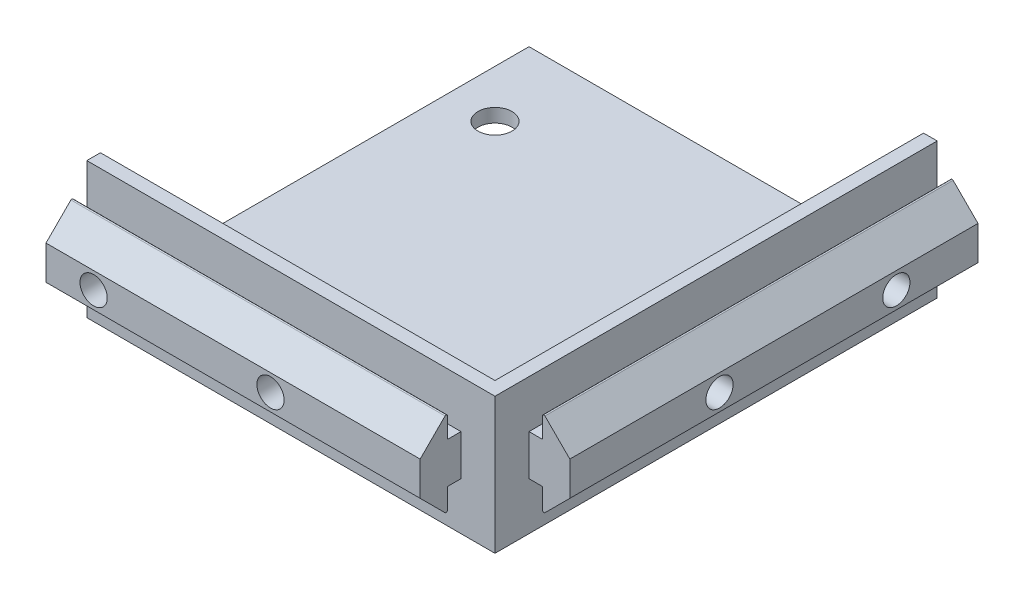
ISO-10303-21;
HEADER;
FILE_DESCRIPTION(('STEP AP214'),'2;1');
FILE_NAME('part.step','',(''),(''),'','','');
FILE_SCHEMA(('AUTOMOTIVE_DESIGN { 1 0 10303 214 1 1 1 1 }'));
ENDSEC;
DATA;
#1=APPLICATION_CONTEXT('core data for automotive mechanical design processes');
#2=APPLICATION_PROTOCOL_DEFINITION('international standard','automotive_design',2000,#1);
#3=PRODUCT_CONTEXT('',#1,'mechanical');
#4=PRODUCT('Part','Part','',(#3));
#5=PRODUCT_RELATED_PRODUCT_CATEGORY('part','',(#4));
#6=PRODUCT_DEFINITION_FORMATION('','',#4);
#7=PRODUCT_DEFINITION_CONTEXT('part definition',#1,'design');
#8=PRODUCT_DEFINITION('design','',#6,#7);
#9=PRODUCT_DEFINITION_SHAPE('','',#8);
#10=(LENGTH_UNIT() NAMED_UNIT(*) SI_UNIT(.MILLI.,.METRE.));
#11=(NAMED_UNIT(*) PLANE_ANGLE_UNIT() SI_UNIT($,.RADIAN.));
#12=(NAMED_UNIT(*) SI_UNIT($,.STERADIAN.) SOLID_ANGLE_UNIT());
#13=UNCERTAINTY_MEASURE_WITH_UNIT(LENGTH_MEASURE(1.E-05),#10,'distance_accuracy_value','');
#14=(GEOMETRIC_REPRESENTATION_CONTEXT(3) GLOBAL_UNCERTAINTY_ASSIGNED_CONTEXT((#13)) GLOBAL_UNIT_ASSIGNED_CONTEXT((#10,
#11,#12)) REPRESENTATION_CONTEXT('',''));
#15=CARTESIAN_POINT('',(0.,0.,0.));
#16=DIRECTION('',(0.,0.,1.));
#17=DIRECTION('',(1.,0.,0.));
#18=AXIS2_PLACEMENT_3D('',#15,#16,#17);
#19=CARTESIAN_POINT('',(30.,-20.,0.));
#20=DIRECTION('',(-1.,0.,0.));
#21=DIRECTION('',(0.,0.,1.));
#22=AXIS2_PLACEMENT_3D('',#19,#20,#21);
#23=PLANE('',#22);
#24=DIRECTION('',(0.,1.,0.));
#25=VECTOR('',#24,1.);
#26=CARTESIAN_POINT('',(30.,-20.,30.));
#27=LINE('',#26,#25);
#28=CARTESIAN_POINT('',(30.,-20.,30.));
#29=VERTEX_POINT('',#28);
#30=CARTESIAN_POINT('',(30.,0.,30.));
#31=VERTEX_POINT('',#30);
#32=EDGE_CURVE('E29',#29,#31,#27,.T.);
#33=ORIENTED_EDGE('',*,*,#32,.F.);
#34=DIRECTION('',(0.,0.,-1.));
#35=VECTOR('',#34,1.);
#36=CARTESIAN_POINT('',(30.,-20.,30.));
#37=LINE('',#36,#35);
#38=CARTESIAN_POINT('',(30.,-20.,-35.));
#39=VERTEX_POINT('',#38);
#40=EDGE_CURVE('E218',#29,#39,#37,.T.);
#41=ORIENTED_EDGE('',*,*,#40,.T.);
#42=DIRECTION('',(0.,-1.,0.));
#43=VECTOR('',#42,1.);
#44=CARTESIAN_POINT('',(30.,0.,-35.));
#45=LINE('',#44,#43);
#46=CARTESIAN_POINT('',(30.,-13.,-35.));
#47=VERTEX_POINT('',#46);
#48=EDGE_CURVE('E216',#47,#39,#45,.T.);
#49=ORIENTED_EDGE('',*,*,#48,.F.);
#50=DIRECTION('',(0.,0.,-1.));
#51=VECTOR('',#50,1.);
#52=CARTESIAN_POINT('',(30.,-13.,25.));
#53=LINE('',#52,#51);
#54=CARTESIAN_POINT('',(30.,-13.,25.));
#55=VERTEX_POINT('',#54);
#56=EDGE_CURVE('E202',#55,#47,#53,.T.);
#57=ORIENTED_EDGE('',*,*,#56,.F.);
#58=DIRECTION('',(0.,-1.,0.));
#59=VECTOR('',#58,1.);
#60=CARTESIAN_POINT('',(30.,0.,25.));
#61=LINE('',#60,#59);
#62=CARTESIAN_POINT('',(30.,-7.,25.));
#63=VERTEX_POINT('',#62);
#64=EDGE_CURVE('E359',#63,#55,#61,.T.);
#65=ORIENTED_EDGE('',*,*,#64,.F.);
#66=DIRECTION('',(0.,0.,-1.));
#67=VECTOR('',#66,1.);
#68=CARTESIAN_POINT('',(30.,-7.,25.));
#69=LINE('',#68,#67);
#70=CARTESIAN_POINT('',(30.,-7.,-35.));
#71=VERTEX_POINT('',#70);
#72=EDGE_CURVE('E212',#63,#71,#69,.T.);
#73=ORIENTED_EDGE('',*,*,#72,.T.);
#74=DIRECTION('',(0.,-1.,0.));
#75=VECTOR('',#74,1.);
#76=CARTESIAN_POINT('',(30.,0.,-35.));
#77=LINE('',#76,#75);
#78=CARTESIAN_POINT('',(30.,0.,-35.));
#79=VERTEX_POINT('',#78);
#80=EDGE_CURVE('E244',#79,#71,#77,.T.);
#81=ORIENTED_EDGE('',*,*,#80,.F.);
#82=DIRECTION('',(0.,0.,1.));
#83=VECTOR('',#82,1.);
#84=CARTESIAN_POINT('',(30.,0.,0.));
#85=LINE('',#84,#83);
#86=EDGE_CURVE('E440',#79,#31,#85,.T.);
#87=ORIENTED_EDGE('',*,*,#86,.T.);
#88=EDGE_LOOP('',(#33,#41,#49,#57,#65,#73,#81,#87));
#89=FACE_BOUND('',#88,.T.);
#90=ADVANCED_FACE('F20',(#89),#23,.F.);
#91=CARTESIAN_POINT('',(0.,-20.,28.));
#92=DIRECTION('',(0.,0.,1.));
#93=DIRECTION('',(1.,0.,0.));
#94=AXIS2_PLACEMENT_3D('',#91,#92,#93);
#95=PLANE('',#94);
#96=CARTESIAN_POINT('',(3.,-10.,28.));
#97=DIRECTION('',(0.,0.,1.));
#98=DIRECTION('',(1.,0.,0.));
#99=AXIS2_PLACEMENT_3D('',#96,#97,#98);
#100=CIRCLE('',#99,2.);
#101=CARTESIAN_POINT('',(5.,-10.,28.));
#102=VERTEX_POINT('',#101);
#103=EDGE_CURVE('E328',#102,#102,#100,.T.);
#104=ORIENTED_EDGE('',*,*,#103,.T.);
#105=EDGE_LOOP('',(#104));
#106=FACE_BOUND('',#105,.T.);
#107=CARTESIAN_POINT('',(-23.,-10.,28.));
#108=DIRECTION('',(0.,0.,1.));
#109=DIRECTION('',(1.,0.,0.));
#110=AXIS2_PLACEMENT_3D('',#107,#108,#109);
#111=CIRCLE('',#110,2.);
#112=CARTESIAN_POINT('',(-21.,-10.,28.));
#113=VERTEX_POINT('',#112);
#114=EDGE_CURVE('E321',#113,#113,#111,.T.);
#115=ORIENTED_EDGE('',*,*,#114,.T.);
#116=EDGE_LOOP('',(#115));
#117=FACE_BOUND('',#116,.T.);
#118=DIRECTION('',(1.,0.,0.));
#119=VECTOR('',#118,1.);
#120=CARTESIAN_POINT('',(0.,-18.,28.));
#121=LINE('',#120,#119);
#122=CARTESIAN_POINT('',(-30.,-18.,28.));
#123=VERTEX_POINT('',#122);
#124=CARTESIAN_POINT('',(28.,-18.,28.));
#125=VERTEX_POINT('',#124);
#126=EDGE_CURVE('E404',#123,#125,#121,.T.);
#127=ORIENTED_EDGE('',*,*,#126,.F.);
#128=DIRECTION('',(0.,1.,0.));
#129=VECTOR('',#128,1.);
#130=CARTESIAN_POINT('',(-30.,-20.,28.));
#131=LINE('',#130,#129);
#132=CARTESIAN_POINT('',(-30.,0.,28.));
#133=VERTEX_POINT('',#132);
#134=EDGE_CURVE('E432',#123,#133,#131,.T.);
#135=ORIENTED_EDGE('',*,*,#134,.T.);
#136=DIRECTION('',(1.,0.,0.));
#137=VECTOR('',#136,1.);
#138=CARTESIAN_POINT('',(0.,0.,28.));
#139=LINE('',#138,#137);
#140=CARTESIAN_POINT('',(28.,0.,28.));
#141=VERTEX_POINT('',#140);
#142=EDGE_CURVE('E413',#133,#141,#139,.T.);
#143=ORIENTED_EDGE('',*,*,#142,.T.);
#144=DIRECTION('',(0.,1.,0.));
#145=VECTOR('',#144,1.);
#146=CARTESIAN_POINT('',(28.,-20.,28.));
#147=LINE('',#146,#145);
#148=EDGE_CURVE('E436',#125,#141,#147,.T.);
#149=ORIENTED_EDGE('',*,*,#148,.F.);
#150=EDGE_LOOP('',(#127,#135,#143,#149));
#151=FACE_BOUND('',#150,.T.);
#152=ADVANCED_FACE('F580',(#106,#117,#151),#95,.F.);
#153=CARTESIAN_POINT('',(28.,-20.,0.));
#154=DIRECTION('',(-1.,0.,0.));
#155=DIRECTION('',(0.,0.,1.));
#156=AXIS2_PLACEMENT_3D('',#153,#154,#155);
#157=PLANE('',#156);
#158=CARTESIAN_POINT('',(28.,-10.,3.));
#159=DIRECTION('',(-1.,0.,0.));
#160=DIRECTION('',(0.,0.,1.));
#161=AXIS2_PLACEMENT_3D('',#158,#159,#160);
#162=CIRCLE('',#161,2.);
#163=CARTESIAN_POINT('',(28.,-10.,5.));
#164=VERTEX_POINT('',#163);
#165=EDGE_CURVE('E312',#164,#164,#162,.T.);
#166=ORIENTED_EDGE('',*,*,#165,.F.);
#167=EDGE_LOOP('',(#166));
#168=FACE_BOUND('',#167,.T.);
#169=CARTESIAN_POINT('',(28.,-10.,-23.));
#170=DIRECTION('',(-1.,0.,0.));
#171=DIRECTION('',(0.,0.,1.));
#172=AXIS2_PLACEMENT_3D('',#169,#170,#171);
#173=CIRCLE('',#172,2.);
#174=CARTESIAN_POINT('',(28.,-10.,-21.));
#175=VERTEX_POINT('',#174);
#176=EDGE_CURVE('E305',#175,#175,#173,.T.);
#177=ORIENTED_EDGE('',*,*,#176,.F.);
#178=EDGE_LOOP('',(#177));
#179=FACE_BOUND('',#178,.T.);
#180=DIRECTION('',(0.,0.,1.));
#181=VECTOR('',#180,1.);
#182=CARTESIAN_POINT('',(28.,0.,0.));
#183=LINE('',#182,#181);
#184=CARTESIAN_POINT('',(28.,0.,-35.));
#185=VERTEX_POINT('',#184);
#186=EDGE_CURVE('E408',#185,#141,#183,.T.);
#187=ORIENTED_EDGE('',*,*,#186,.F.);
#188=DIRECTION('',(0.,1.,0.));
#189=VECTOR('',#188,1.);
#190=CARTESIAN_POINT('',(28.,0.,-35.));
#191=LINE('',#190,#189);
#192=CARTESIAN_POINT('',(28.,-18.,-35.));
#193=VERTEX_POINT('',#192);
#194=EDGE_CURVE('E238',#193,#185,#191,.T.);
#195=ORIENTED_EDGE('',*,*,#194,.F.);
#196=DIRECTION('',(0.,0.,1.));
#197=VECTOR('',#196,1.);
#198=CARTESIAN_POINT('',(28.,-18.,0.));
#199=LINE('',#198,#197);
#200=EDGE_CURVE('E12',#193,#125,#199,.T.);
#201=ORIENTED_EDGE('',*,*,#200,.T.);
#202=ORIENTED_EDGE('',*,*,#148,.T.);
#203=EDGE_LOOP('',(#187,#195,#201,#202));
#204=FACE_BOUND('',#203,.T.);
#205=ADVANCED_FACE('F22',(#168,#179,#204),#157,.T.);
#206=CARTESIAN_POINT('',(0.,-20.,30.));
#207=DIRECTION('',(0.,0.,1.));
#208=DIRECTION('',(1.,0.,0.));
#209=AXIS2_PLACEMENT_3D('',#206,#207,#208);
#210=PLANE('',#209);
#211=DIRECTION('',(0.,1.,0.));
#212=VECTOR('',#211,1.);
#213=CARTESIAN_POINT('',(-30.,-20.,30.));
#214=LINE('',#213,#212);
#215=CARTESIAN_POINT('',(-30.,-20.,30.));
#216=VERTEX_POINT('',#215);
#217=CARTESIAN_POINT('',(-30.,-13.,30.));
#218=VERTEX_POINT('',#217);
#219=EDGE_CURVE('E36',#216,#218,#214,.T.);
#220=ORIENTED_EDGE('',*,*,#219,.F.);
#221=DIRECTION('',(1.,0.,0.));
#222=VECTOR('',#221,1.);
#223=CARTESIAN_POINT('',(-30.,-20.,30.));
#224=LINE('',#223,#222);
#225=EDGE_CURVE('E295',#216,#29,#224,.T.);
#226=ORIENTED_EDGE('',*,*,#225,.T.);
#227=ORIENTED_EDGE('',*,*,#32,.T.);
#228=DIRECTION('',(1.,0.,0.));
#229=VECTOR('',#228,1.);
#230=CARTESIAN_POINT('',(0.,0.,30.));
#231=LINE('',#230,#229);
#232=CARTESIAN_POINT('',(-30.,0.,30.));
#233=VERTEX_POINT('',#232);
#234=EDGE_CURVE('E422',#233,#31,#231,.T.);
#235=ORIENTED_EDGE('',*,*,#234,.F.);
#236=CARTESIAN_POINT('',(-30.,-7.,30.));
#237=VERTEX_POINT('',#236);
#238=EDGE_CURVE('E435',#237,#233,#214,.T.);
#239=ORIENTED_EDGE('',*,*,#238,.F.);
#240=DIRECTION('',(-1.,0.,0.));
#241=VECTOR('',#240,1.);
#242=CARTESIAN_POINT('',(25.,-7.,30.));
#243=LINE('',#242,#241);
#244=CARTESIAN_POINT('',(25.,-7.,30.));
#245=VERTEX_POINT('',#244);
#246=EDGE_CURVE('E388',#245,#237,#243,.T.);
#247=ORIENTED_EDGE('',*,*,#246,.F.);
#248=DIRECTION('',(0.,1.,0.));
#249=VECTOR('',#248,1.);
#250=CARTESIAN_POINT('',(25.,0.,30.));
#251=LINE('',#250,#249);
#252=CARTESIAN_POINT('',(25.,-13.,30.));
#253=VERTEX_POINT('',#252);
#254=EDGE_CURVE('E458',#253,#245,#251,.T.);
#255=ORIENTED_EDGE('',*,*,#254,.F.);
#256=DIRECTION('',(-1.,0.,0.));
#257=VECTOR('',#256,1.);
#258=CARTESIAN_POINT('',(25.,-13.,30.));
#259=LINE('',#258,#257);
#260=EDGE_CURVE('E393',#253,#218,#259,.T.);
#261=ORIENTED_EDGE('',*,*,#260,.T.);
#262=EDGE_LOOP('',(#220,#226,#227,#235,#239,#247,#255,#261));
#263=FACE_BOUND('',#262,.T.);
#264=ADVANCED_FACE('F546',(#263),#210,.T.);
#265=CARTESIAN_POINT('',(-30.,-20.,0.));
#266=DIRECTION('',(-1.,0.,0.));
#267=DIRECTION('',(0.,0.,1.));
#268=AXIS2_PLACEMENT_3D('',#265,#266,#267);
#269=PLANE('',#268);
#270=ORIENTED_EDGE('',*,*,#134,.F.);
#271=DIRECTION('',(0.,0.,1.));
#272=VECTOR('',#271,1.);
#273=CARTESIAN_POINT('',(-30.,-18.,-30.));
#274=LINE('',#273,#272);
#275=CARTESIAN_POINT('',(-30.,-18.,-35.));
#276=VERTEX_POINT('',#275);
#277=EDGE_CURVE('E290',#276,#123,#274,.T.);
#278=ORIENTED_EDGE('',*,*,#277,.F.);
#279=DIRECTION('',(0.,1.,0.));
#280=VECTOR('',#279,1.);
#281=CARTESIAN_POINT('',(-30.,0.,-35.));
#282=LINE('',#281,#280);
#283=CARTESIAN_POINT('',(-30.,-20.,-35.));
#284=VERTEX_POINT('',#283);
#285=EDGE_CURVE('E232',#284,#276,#282,.T.);
#286=ORIENTED_EDGE('',*,*,#285,.F.);
#287=DIRECTION('',(0.,0.,1.));
#288=VECTOR('',#287,1.);
#289=CARTESIAN_POINT('',(-30.,-20.,-30.));
#290=LINE('',#289,#288);
#291=EDGE_CURVE('E293',#284,#216,#290,.T.);
#292=ORIENTED_EDGE('',*,*,#291,.T.);
#293=ORIENTED_EDGE('',*,*,#219,.T.);
#294=DIRECTION('',(0.,0.,1.));
#295=VECTOR('',#294,1.);
#296=CARTESIAN_POINT('',(-30.,-13.,0.));
#297=LINE('',#296,#295);
#298=CARTESIAN_POINT('',(-30.,-13.,32.));
#299=VERTEX_POINT('',#298);
#300=EDGE_CURVE('E496',#218,#299,#297,.T.);
#301=ORIENTED_EDGE('',*,*,#300,.T.);
#302=DIRECTION('',(0.,-1.,0.));
#303=VECTOR('',#302,1.);
#304=CARTESIAN_POINT('',(-30.,-4.41563863792763E-13,32.));
#305=LINE('',#304,#303);
#306=CARTESIAN_POINT('',(-30.,-16.0171572875254,32.));
#307=VERTEX_POINT('',#306);
#308=EDGE_CURVE('E500',#299,#307,#305,.T.);
#309=ORIENTED_EDGE('',*,*,#308,.T.);
#310=CARTESIAN_POINT('',(-30.,-16.0171572875253,32.2));
#311=DIRECTION('',(-1.,0.,0.));
#312=DIRECTION('',(0.,0.,1.));
#313=AXIS2_PLACEMENT_3D('',#310,#311,#312);
#314=CIRCLE('',#313,0.200000000000007);
#315=CARTESIAN_POINT('',(-30.,-16.1585786437627,32.3414213562373));
#316=VERTEX_POINT('',#315);
#317=EDGE_CURVE('E504',#316,#307,#314,.F.);
#318=ORIENTED_EDGE('',*,*,#317,.F.);
#319=DIRECTION('',(0.,0.70710678118655,0.707106781186545));
#320=VECTOR('',#319,1.);
#321=CARTESIAN_POINT('',(-30.,-24.25,24.25));
#322=LINE('',#321,#320);
#323=CARTESIAN_POINT('',(-30.,-12.5,36.));
#324=VERTEX_POINT('',#323);
#325=EDGE_CURVE('E508',#316,#324,#322,.T.);
#326=ORIENTED_EDGE('',*,*,#325,.T.);
#327=DIRECTION('',(0.,1.,0.));
#328=VECTOR('',#327,1.);
#329=CARTESIAN_POINT('',(-30.,0.,36.));
#330=LINE('',#329,#328);
#331=CARTESIAN_POINT('',(-30.,-7.5,36.));
#332=VERTEX_POINT('',#331);
#333=EDGE_CURVE('E512',#324,#332,#330,.T.);
#334=ORIENTED_EDGE('',*,*,#333,.T.);
#335=DIRECTION('',(0.,-0.707106781186545,0.70710678118655));
#336=VECTOR('',#335,1.);
#337=CARTESIAN_POINT('',(-30.,14.25,14.2499999999999));
#338=LINE('',#337,#336);
#339=CARTESIAN_POINT('',(-30.,-3.84142135623735,32.3414213562373));
#340=VERTEX_POINT('',#339);
#341=EDGE_CURVE('E516',#340,#332,#338,.T.);
#342=ORIENTED_EDGE('',*,*,#341,.F.);
#343=CARTESIAN_POINT('',(-30.,-3.98284271247466,32.2));
#344=DIRECTION('',(-1.,0.,0.));
#345=DIRECTION('',(0.,0.,1.));
#346=AXIS2_PLACEMENT_3D('',#343,#344,#345);
#347=CIRCLE('',#346,0.199999999999998);
#348=CARTESIAN_POINT('',(-30.,-3.98284271247466,32.));
#349=VERTEX_POINT('',#348);
#350=EDGE_CURVE('E486',#349,#340,#347,.F.);
#351=ORIENTED_EDGE('',*,*,#350,.F.);
#352=DIRECTION('',(0.,1.,0.));
#353=VECTOR('',#352,1.);
#354=CARTESIAN_POINT('',(-30.,0.,32.));
#355=LINE('',#354,#353);
#356=CARTESIAN_POINT('',(-30.,-7.,32.));
#357=VERTEX_POINT('',#356);
#358=EDGE_CURVE('E490',#357,#349,#355,.T.);
#359=ORIENTED_EDGE('',*,*,#358,.F.);
#360=DIRECTION('',(0.,0.,-1.));
#361=VECTOR('',#360,1.);
#362=CARTESIAN_POINT('',(-30.,-7.,0.));
#363=LINE('',#362,#361);
#364=EDGE_CURVE('E493',#357,#237,#363,.T.);
#365=ORIENTED_EDGE('',*,*,#364,.T.);
#366=ORIENTED_EDGE('',*,*,#238,.T.);
#367=DIRECTION('',(0.,0.,1.));
#368=VECTOR('',#367,1.);
#369=CARTESIAN_POINT('',(-30.,0.,0.));
#370=LINE('',#369,#368);
#371=EDGE_CURVE('E417',#133,#233,#370,.T.);
#372=ORIENTED_EDGE('',*,*,#371,.F.);
#373=EDGE_LOOP('',(#270,#278,#286,#292,#293,#301,#309,#318,#326,#334,#342,#351,#359,#365,#366,#372));
#374=FACE_BOUND('',#373,.T.);
#375=ADVANCED_FACE('F564',(#374),#269,.T.);
#376=CARTESIAN_POINT('',(0.,0.,0.));
#377=DIRECTION('',(0.,1.,0.));
#378=DIRECTION('',(0.,0.,1.));
#379=AXIS2_PLACEMENT_3D('',#376,#377,#378);
#380=PLANE('',#379);
#381=ORIENTED_EDGE('',*,*,#86,.F.);
#382=DIRECTION('',(1.,0.,0.));
#383=VECTOR('',#382,1.);
#384=CARTESIAN_POINT('',(0.,0.,-35.));
#385=LINE('',#384,#383);
#386=EDGE_CURVE('E241',#185,#79,#385,.T.);
#387=ORIENTED_EDGE('',*,*,#386,.F.);
#388=ORIENTED_EDGE('',*,*,#186,.T.);
#389=ORIENTED_EDGE('',*,*,#142,.F.);
#390=ORIENTED_EDGE('',*,*,#371,.T.);
#391=ORIENTED_EDGE('',*,*,#234,.T.);
#392=EDGE_LOOP('',(#381,#387,#388,#389,#390,#391));
#393=FACE_BOUND('',#392,.T.);
#394=ADVANCED_FACE('F567',(#393),#380,.T.);
#395=CARTESIAN_POINT('',(25.,-3.98284271247466,32.2));
#396=DIRECTION('',(-1.,0.,0.));
#397=DIRECTION('',(0.,0.,1.));
#398=AXIS2_PLACEMENT_3D('',#395,#396,#397);
#399=CYLINDRICAL_SURFACE('',#398,0.199999999999998);
#400=ORIENTED_EDGE('',*,*,#350,.T.);
#401=DIRECTION('',(-1.,0.,0.));
#402=VECTOR('',#401,1.);
#403=CARTESIAN_POINT('',(25.,-3.84142135623735,32.3414213562373));
#404=LINE('',#403,#402);
#405=CARTESIAN_POINT('',(25.,-3.84142135623735,32.3414213562373));
#406=VERTEX_POINT('',#405);
#407=EDGE_CURVE('E409',#406,#340,#404,.T.);
#408=ORIENTED_EDGE('',*,*,#407,.F.);
#409=CARTESIAN_POINT('',(25.,-3.98284271247466,32.2));
#410=DIRECTION('',(-1.,0.,0.));
#411=DIRECTION('',(0.,0.,1.));
#412=AXIS2_PLACEMENT_3D('',#409,#410,#411);
#413=CIRCLE('',#412,0.199999999999998);
#414=CARTESIAN_POINT('',(25.,-3.98284271247466,32.));
#415=VERTEX_POINT('',#414);
#416=EDGE_CURVE('E520',#415,#406,#413,.F.);
#417=ORIENTED_EDGE('',*,*,#416,.F.);
#418=DIRECTION('',(-1.,0.,0.));
#419=VECTOR('',#418,1.);
#420=CARTESIAN_POINT('',(25.,-3.98284271247466,32.));
#421=LINE('',#420,#419);
#422=EDGE_CURVE('E399',#415,#349,#421,.T.);
#423=ORIENTED_EDGE('',*,*,#422,.T.);
#424=EDGE_LOOP('',(#400,#408,#417,#423));
#425=FACE_BOUND('',#424,.T.);
#426=ADVANCED_FACE('F575',(#425),#399,.T.);
#427=CARTESIAN_POINT('',(25.,14.25,14.2499999999998));
#428=DIRECTION('',(0.,-0.70710678118655,-0.707106781186545));
#429=DIRECTION('',(0.,0.707106781186545,-0.70710678118655));
#430=AXIS2_PLACEMENT_3D('',#427,#428,#429);
#431=PLANE('',#430);
#432=ORIENTED_EDGE('',*,*,#341,.T.);
#433=DIRECTION('',(-1.,0.,0.));
#434=VECTOR('',#433,1.);
#435=CARTESIAN_POINT('',(25.,-7.5,36.));
#436=LINE('',#435,#434);
#437=CARTESIAN_POINT('',(25.,-7.5,36.));
#438=VERTEX_POINT('',#437);
#439=EDGE_CURVE('E524',#438,#332,#436,.T.);
#440=ORIENTED_EDGE('',*,*,#439,.F.);
#441=DIRECTION('',(0.,-0.707106781186545,0.70710678118655));
#442=VECTOR('',#441,1.);
#443=CARTESIAN_POINT('',(25.,14.25,14.2499999999998));
#444=LINE('',#443,#442);
#445=EDGE_CURVE('E403',#406,#438,#444,.T.);
#446=ORIENTED_EDGE('',*,*,#445,.F.);
#447=ORIENTED_EDGE('',*,*,#407,.T.);
#448=EDGE_LOOP('',(#432,#440,#446,#447));
#449=FACE_BOUND('',#448,.T.);
#450=ADVANCED_FACE('F590',(#449),#431,.F.);
#451=CARTESIAN_POINT('',(25.,0.,36.));
#452=DIRECTION('',(0.,0.,1.));
#453=DIRECTION('',(0.,-1.,0.));
#454=AXIS2_PLACEMENT_3D('',#451,#452,#453);
#455=PLANE('',#454);
#456=CARTESIAN_POINT('',(3.,-10.,36.));
#457=DIRECTION('',(0.,0.,1.));
#458=DIRECTION('',(1.,0.,0.));
#459=AXIS2_PLACEMENT_3D('',#456,#457,#458);
#460=CIRCLE('',#459,2.);
#461=CARTESIAN_POINT('',(5.,-10.,36.));
#462=VERTEX_POINT('',#461);
#463=EDGE_CURVE('E317',#462,#462,#460,.T.);
#464=ORIENTED_EDGE('',*,*,#463,.F.);
#465=EDGE_LOOP('',(#464));
#466=FACE_BOUND('',#465,.T.);
#467=CARTESIAN_POINT('',(-23.,-10.,36.));
#468=DIRECTION('',(0.,0.,1.));
#469=DIRECTION('',(1.,0.,0.));
#470=AXIS2_PLACEMENT_3D('',#467,#468,#469);
#471=CIRCLE('',#470,2.);
#472=CARTESIAN_POINT('',(-21.,-10.,36.));
#473=VERTEX_POINT('',#472);
#474=EDGE_CURVE('E316',#473,#473,#471,.T.);
#475=ORIENTED_EDGE('',*,*,#474,.F.);
#476=EDGE_LOOP('',(#475));
#477=FACE_BOUND('',#476,.T.);
#478=ORIENTED_EDGE('',*,*,#333,.F.);
#479=DIRECTION('',(-1.,0.,0.));
#480=VECTOR('',#479,1.);
#481=CARTESIAN_POINT('',(25.,-12.5,36.));
#482=LINE('',#481,#480);
#483=CARTESIAN_POINT('',(25.,-12.5,36.));
#484=VERTEX_POINT('',#483);
#485=EDGE_CURVE('E527',#484,#324,#482,.T.);
#486=ORIENTED_EDGE('',*,*,#485,.F.);
#487=DIRECTION('',(0.,1.,0.));
#488=VECTOR('',#487,1.);
#489=CARTESIAN_POINT('',(25.,0.,36.));
#490=LINE('',#489,#488);
#491=EDGE_CURVE('E480',#484,#438,#490,.T.);
#492=ORIENTED_EDGE('',*,*,#491,.T.);
#493=ORIENTED_EDGE('',*,*,#439,.T.);
#494=EDGE_LOOP('',(#478,#486,#492,#493));
#495=FACE_BOUND('',#494,.T.);
#496=ADVANCED_FACE('F611',(#466,#477,#495),#455,.T.);
#497=CARTESIAN_POINT('',(25.,-24.25,24.25));
#498=DIRECTION('',(0.,-0.707106781186545,0.70710678118655));
#499=DIRECTION('',(0.,-0.70710678118655,-0.707106781186545));
#500=AXIS2_PLACEMENT_3D('',#497,#498,#499);
#501=PLANE('',#500);
#502=ORIENTED_EDGE('',*,*,#325,.F.);
#503=DIRECTION('',(-1.,0.,0.));
#504=VECTOR('',#503,1.);
#505=CARTESIAN_POINT('',(25.,-16.1585786437627,32.3414213562373));
#506=LINE('',#505,#504);
#507=CARTESIAN_POINT('',(25.,-16.1585786437627,32.3414213562373));
#508=VERTEX_POINT('',#507);
#509=EDGE_CURVE('E530',#508,#316,#506,.T.);
#510=ORIENTED_EDGE('',*,*,#509,.F.);
#511=DIRECTION('',(0.,0.70710678118655,0.707106781186545));
#512=VECTOR('',#511,1.);
#513=CARTESIAN_POINT('',(25.,-24.25,24.25));
#514=LINE('',#513,#512);
#515=EDGE_CURVE('E476',#508,#484,#514,.T.);
#516=ORIENTED_EDGE('',*,*,#515,.T.);
#517=ORIENTED_EDGE('',*,*,#485,.T.);
#518=EDGE_LOOP('',(#502,#510,#516,#517));
#519=FACE_BOUND('',#518,.T.);
#520=ADVANCED_FACE('F607',(#519),#501,.T.);
#521=CARTESIAN_POINT('',(25.,-16.0171572875253,32.2));
#522=DIRECTION('',(-1.,0.,0.));
#523=DIRECTION('',(0.,0.,1.));
#524=AXIS2_PLACEMENT_3D('',#521,#522,#523);
#525=CYLINDRICAL_SURFACE('',#524,0.200000000000007);
#526=ORIENTED_EDGE('',*,*,#317,.T.);
#527=DIRECTION('',(-1.,0.,0.));
#528=VECTOR('',#527,1.);
#529=CARTESIAN_POINT('',(25.,-16.0171572875254,32.));
#530=LINE('',#529,#528);
#531=CARTESIAN_POINT('',(25.,-16.0171572875254,32.));
#532=VERTEX_POINT('',#531);
#533=EDGE_CURVE('E533',#532,#307,#530,.T.);
#534=ORIENTED_EDGE('',*,*,#533,.F.);
#535=CARTESIAN_POINT('',(25.,-16.0171572875253,32.2));
#536=DIRECTION('',(-1.,0.,0.));
#537=DIRECTION('',(0.,0.,1.));
#538=AXIS2_PLACEMENT_3D('',#535,#536,#537);
#539=CIRCLE('',#538,0.200000000000007);
#540=EDGE_CURVE('E473',#508,#532,#539,.F.);
#541=ORIENTED_EDGE('',*,*,#540,.F.);
#542=ORIENTED_EDGE('',*,*,#509,.T.);
#543=EDGE_LOOP('',(#526,#534,#541,#542));
#544=FACE_BOUND('',#543,.T.);
#545=ADVANCED_FACE('F604',(#544),#525,.T.);
#546=CARTESIAN_POINT('',(25.,-4.41563863792763E-13,32.));
#547=DIRECTION('',(0.,0.,-1.));
#548=DIRECTION('',(0.,1.,0.));
#549=AXIS2_PLACEMENT_3D('',#546,#547,#548);
#550=PLANE('',#549);
#551=ORIENTED_EDGE('',*,*,#308,.F.);
#552=DIRECTION('',(-1.,0.,0.));
#553=VECTOR('',#552,1.);
#554=CARTESIAN_POINT('',(25.,-13.,32.));
#555=LINE('',#554,#553);
#556=CARTESIAN_POINT('',(25.,-13.,32.));
#557=VERTEX_POINT('',#556);
#558=EDGE_CURVE('E535',#557,#299,#555,.T.);
#559=ORIENTED_EDGE('',*,*,#558,.F.);
#560=DIRECTION('',(0.,-1.,0.));
#561=VECTOR('',#560,1.);
#562=CARTESIAN_POINT('',(25.,-4.41563863792763E-13,32.));
#563=LINE('',#562,#561);
#564=EDGE_CURVE('E469',#557,#532,#563,.T.);
#565=ORIENTED_EDGE('',*,*,#564,.T.);
#566=ORIENTED_EDGE('',*,*,#533,.T.);
#567=EDGE_LOOP('',(#551,#559,#565,#566));
#568=FACE_BOUND('',#567,.T.);
#569=ADVANCED_FACE('F561',(#568),#550,.T.);
#570=CARTESIAN_POINT('',(25.,-13.,0.));
#571=DIRECTION('',(0.,-1.,0.));
#572=DIRECTION('',(0.,0.,-1.));
#573=AXIS2_PLACEMENT_3D('',#570,#571,#572);
#574=PLANE('',#573);
#575=ORIENTED_EDGE('',*,*,#300,.F.);
#576=ORIENTED_EDGE('',*,*,#260,.F.);
#577=DIRECTION('',(0.,0.,1.));
#578=VECTOR('',#577,1.);
#579=CARTESIAN_POINT('',(25.,-13.,0.));
#580=LINE('',#579,#578);
#581=EDGE_CURVE('E463',#253,#557,#580,.T.);
#582=ORIENTED_EDGE('',*,*,#581,.T.);
#583=ORIENTED_EDGE('',*,*,#558,.T.);
#584=EDGE_LOOP('',(#575,#576,#582,#583));
#585=FACE_BOUND('',#584,.T.);
#586=ADVANCED_FACE('F550',(#585),#574,.T.);
#587=CARTESIAN_POINT('',(25.,-7.,0.));
#588=DIRECTION('',(0.,1.,0.));
#589=DIRECTION('',(0.,0.,1.));
#590=AXIS2_PLACEMENT_3D('',#587,#588,#589);
#591=PLANE('',#590);
#592=ORIENTED_EDGE('',*,*,#364,.F.);
#593=DIRECTION('',(-1.,0.,0.));
#594=VECTOR('',#593,1.);
#595=CARTESIAN_POINT('',(25.,-7.,32.));
#596=LINE('',#595,#594);
#597=CARTESIAN_POINT('',(25.,-7.,32.));
#598=VERTEX_POINT('',#597);
#599=EDGE_CURVE('E394',#598,#357,#596,.T.);
#600=ORIENTED_EDGE('',*,*,#599,.F.);
#601=DIRECTION('',(0.,0.,-1.));
#602=VECTOR('',#601,1.);
#603=CARTESIAN_POINT('',(25.,-7.,0.));
#604=LINE('',#603,#602);
#605=EDGE_CURVE('E464',#598,#245,#604,.T.);
#606=ORIENTED_EDGE('',*,*,#605,.T.);
#607=ORIENTED_EDGE('',*,*,#246,.T.);
#608=EDGE_LOOP('',(#592,#600,#606,#607));
#609=FACE_BOUND('',#608,.T.);
#610=ADVANCED_FACE('F595',(#609),#591,.T.);
#611=CARTESIAN_POINT('',(25.,0.,32.));
#612=DIRECTION('',(0.,0.,1.));
#613=DIRECTION('',(1.,0.,0.));
#614=AXIS2_PLACEMENT_3D('',#611,#612,#613);
#615=PLANE('',#614);
#616=ORIENTED_EDGE('',*,*,#358,.T.);
#617=ORIENTED_EDGE('',*,*,#422,.F.);
#618=DIRECTION('',(0.,1.,0.));
#619=VECTOR('',#618,1.);
#620=CARTESIAN_POINT('',(25.,0.,32.));
#621=LINE('',#620,#619);
#622=EDGE_CURVE('E1121',#598,#415,#621,.T.);
#623=ORIENTED_EDGE('',*,*,#622,.F.);
#624=ORIENTED_EDGE('',*,*,#599,.T.);
#625=EDGE_LOOP('',(#616,#617,#623,#624));
#626=FACE_BOUND('',#625,.T.);
#627=ADVANCED_FACE('F592',(#626),#615,.F.);
#628=CARTESIAN_POINT('',(25.,0.,0.));
#629=DIRECTION('',(-1.,0.,0.));
#630=DIRECTION('',(0.,0.,1.));
#631=AXIS2_PLACEMENT_3D('',#628,#629,#630);
#632=PLANE('',#631);
#633=ORIENTED_EDGE('',*,*,#416,.T.);
#634=ORIENTED_EDGE('',*,*,#445,.T.);
#635=ORIENTED_EDGE('',*,*,#491,.F.);
#636=ORIENTED_EDGE('',*,*,#515,.F.);
#637=ORIENTED_EDGE('',*,*,#540,.T.);
#638=ORIENTED_EDGE('',*,*,#564,.F.);
#639=ORIENTED_EDGE('',*,*,#581,.F.);
#640=ORIENTED_EDGE('',*,*,#254,.T.);
#641=ORIENTED_EDGE('',*,*,#605,.F.);
#642=ORIENTED_EDGE('',*,*,#622,.T.);
#643=EDGE_LOOP('',(#633,#634,#635,#636,#637,#638,#639,#640,#641,#642));
#644=FACE_BOUND('',#643,.T.);
#645=ADVANCED_FACE('F554',(#644),#632,.F.);
#646=CARTESIAN_POINT('',(32.,0.,25.));
#647=DIRECTION('',(-1.,0.,0.));
#648=DIRECTION('',(0.,0.,1.));
#649=AXIS2_PLACEMENT_3D('',#646,#647,#648);
#650=PLANE('',#649);
#651=DIRECTION('',(0.,0.,-1.));
#652=VECTOR('',#651,1.);
#653=CARTESIAN_POINT('',(32.,-3.98284271247466,25.));
#654=LINE('',#653,#652);
#655=CARTESIAN_POINT('',(32.,-3.98284271247466,25.));
#656=VERTEX_POINT('',#655);
#657=CARTESIAN_POINT('',(32.,-3.98284271247466,-35.));
#658=VERTEX_POINT('',#657);
#659=EDGE_CURVE('E1200',#656,#658,#654,.T.);
#660=ORIENTED_EDGE('',*,*,#659,.T.);
#661=DIRECTION('',(0.,1.,0.));
#662=VECTOR('',#661,1.);
#663=CARTESIAN_POINT('',(32.,0.,-35.));
#664=LINE('',#663,#662);
#665=CARTESIAN_POINT('',(32.,-7.,-35.));
#666=VERTEX_POINT('',#665);
#667=EDGE_CURVE('E250',#666,#658,#664,.T.);
#668=ORIENTED_EDGE('',*,*,#667,.F.);
#669=DIRECTION('',(0.,0.,-1.));
#670=VECTOR('',#669,1.);
#671=CARTESIAN_POINT('',(32.,-7.,25.));
#672=LINE('',#671,#670);
#673=CARTESIAN_POINT('',(32.,-7.,25.));
#674=VERTEX_POINT('',#673);
#675=EDGE_CURVE('E375',#674,#666,#672,.T.);
#676=ORIENTED_EDGE('',*,*,#675,.F.);
#677=DIRECTION('',(0.,1.,0.));
#678=VECTOR('',#677,1.);
#679=CARTESIAN_POINT('',(32.,0.,25.));
#680=LINE('',#679,#678);
#681=EDGE_CURVE('E332',#674,#656,#680,.T.);
#682=ORIENTED_EDGE('',*,*,#681,.T.);
#683=EDGE_LOOP('',(#660,#668,#676,#682));
#684=FACE_BOUND('',#683,.T.);
#685=ADVANCED_FACE('F621',(#684),#650,.T.);
#686=CARTESIAN_POINT('',(0.,-7.,25.));
#687=DIRECTION('',(0.,1.,0.));
#688=DIRECTION('',(0.,0.,1.));
#689=AXIS2_PLACEMENT_3D('',#686,#687,#688);
#690=PLANE('',#689);
#691=ORIENTED_EDGE('',*,*,#675,.T.);
#692=DIRECTION('',(1.,0.,0.));
#693=VECTOR('',#692,1.);
#694=CARTESIAN_POINT('',(0.,-7.,-35.));
#695=LINE('',#694,#693);
#696=EDGE_CURVE('E247',#71,#666,#695,.T.);
#697=ORIENTED_EDGE('',*,*,#696,.F.);
#698=ORIENTED_EDGE('',*,*,#72,.F.);
#699=DIRECTION('',(1.,0.,0.));
#700=VECTOR('',#699,1.);
#701=CARTESIAN_POINT('',(0.,-7.,25.));
#702=LINE('',#701,#700);
#703=EDGE_CURVE('E363',#63,#674,#702,.T.);
#704=ORIENTED_EDGE('',*,*,#703,.T.);
#705=EDGE_LOOP('',(#691,#697,#698,#704));
#706=FACE_BOUND('',#705,.T.);
#707=ADVANCED_FACE('F624',(#706),#690,.T.);
#708=CARTESIAN_POINT('',(0.,-13.,25.));
#709=DIRECTION('',(0.,-1.,0.));
#710=DIRECTION('',(0.,0.,-1.));
#711=AXIS2_PLACEMENT_3D('',#708,#709,#710);
#712=PLANE('',#711);
#713=ORIENTED_EDGE('',*,*,#56,.T.);
#714=DIRECTION('',(-1.,0.,0.));
#715=VECTOR('',#714,1.);
#716=CARTESIAN_POINT('',(0.,-13.,-35.));
#717=LINE('',#716,#715);
#718=CARTESIAN_POINT('',(32.,-13.,-35.));
#719=VERTEX_POINT('',#718);
#720=EDGE_CURVE('E206',#719,#47,#717,.T.);
#721=ORIENTED_EDGE('',*,*,#720,.F.);
#722=DIRECTION('',(0.,0.,-1.));
#723=VECTOR('',#722,1.);
#724=CARTESIAN_POINT('',(32.,-13.,25.));
#725=LINE('',#724,#723);
#726=CARTESIAN_POINT('',(32.,-13.,25.));
#727=VERTEX_POINT('',#726);
#728=EDGE_CURVE('E213',#727,#719,#725,.T.);
#729=ORIENTED_EDGE('',*,*,#728,.F.);
#730=DIRECTION('',(-1.,0.,0.));
#731=VECTOR('',#730,1.);
#732=CARTESIAN_POINT('',(0.,-13.,25.));
#733=LINE('',#732,#731);
#734=EDGE_CURVE('E208',#727,#55,#733,.T.);
#735=ORIENTED_EDGE('',*,*,#734,.T.);
#736=EDGE_LOOP('',(#713,#721,#729,#735));
#737=FACE_BOUND('',#736,.T.);
#738=ADVANCED_FACE('F204',(#737),#712,.T.);
#739=CARTESIAN_POINT('',(32.,0.,25.));
#740=DIRECTION('',(1.,0.,0.));
#741=DIRECTION('',(0.,0.,-1.));
#742=AXIS2_PLACEMENT_3D('',#739,#740,#741);
#743=PLANE('',#742);
#744=ORIENTED_EDGE('',*,*,#728,.T.);
#745=DIRECTION('',(0.,1.,0.));
#746=VECTOR('',#745,1.);
#747=CARTESIAN_POINT('',(32.,0.,-35.));
#748=LINE('',#747,#746);
#749=CARTESIAN_POINT('',(32.,-16.0171572875253,-35.));
#750=VERTEX_POINT('',#749);
#751=EDGE_CURVE('E228',#750,#719,#748,.T.);
#752=ORIENTED_EDGE('',*,*,#751,.F.);
#753=DIRECTION('',(0.,0.,-1.));
#754=VECTOR('',#753,1.);
#755=CARTESIAN_POINT('',(32.,-16.0171572875253,25.));
#756=LINE('',#755,#754);
#757=CARTESIAN_POINT('',(32.,-16.0171572875253,25.));
#758=VERTEX_POINT('',#757);
#759=EDGE_CURVE('E1172',#758,#750,#756,.T.);
#760=ORIENTED_EDGE('',*,*,#759,.F.);
#761=DIRECTION('',(0.,-1.,0.));
#762=VECTOR('',#761,1.);
#763=CARTESIAN_POINT('',(32.,0.,25.));
#764=LINE('',#763,#762);
#765=EDGE_CURVE('E354',#727,#758,#764,.T.);
#766=ORIENTED_EDGE('',*,*,#765,.F.);
#767=EDGE_LOOP('',(#744,#752,#760,#766));
#768=FACE_BOUND('',#767,.T.);
#769=ADVANCED_FACE('F646',(#768),#743,.F.);
#770=CARTESIAN_POINT('',(32.2,-16.0171572875253,25.));
#771=DIRECTION('',(0.,0.,-1.));
#772=DIRECTION('',(-1.,0.,0.));
#773=AXIS2_PLACEMENT_3D('',#770,#771,#772);
#774=CYLINDRICAL_SURFACE('',#773,0.2);
#775=ORIENTED_EDGE('',*,*,#759,.T.);
#776=CARTESIAN_POINT('',(32.2,-16.0171572875253,-35.));
#777=DIRECTION('',(0.,0.,-1.));
#778=DIRECTION('',(-1.,0.,0.));
#779=AXIS2_PLACEMENT_3D('',#776,#777,#778);
#780=CIRCLE('',#779,0.2);
#781=CARTESIAN_POINT('',(32.3414213562373,-16.1585786437627,-35.));
#782=VERTEX_POINT('',#781);
#783=EDGE_CURVE('E265',#782,#750,#780,.T.);
#784=ORIENTED_EDGE('',*,*,#783,.F.);
#785=DIRECTION('',(0.,0.,-1.));
#786=VECTOR('',#785,1.);
#787=CARTESIAN_POINT('',(32.3414213562373,-16.1585786437627,25.));
#788=LINE('',#787,#786);
#789=CARTESIAN_POINT('',(32.3414213562373,-16.1585786437627,25.));
#790=VERTEX_POINT('',#789);
#791=EDGE_CURVE('E1177',#790,#782,#788,.T.);
#792=ORIENTED_EDGE('',*,*,#791,.F.);
#793=CARTESIAN_POINT('',(32.2,-16.0171572875253,25.));
#794=DIRECTION('',(0.,0.,-1.));
#795=DIRECTION('',(-1.,0.,0.));
#796=AXIS2_PLACEMENT_3D('',#793,#794,#795);
#797=CIRCLE('',#796,0.2);
#798=EDGE_CURVE('E351',#758,#790,#797,.F.);
#799=ORIENTED_EDGE('',*,*,#798,.F.);
#800=EDGE_LOOP('',(#775,#784,#792,#799));
#801=FACE_BOUND('',#800,.T.);
#802=ADVANCED_FACE('F642',(#801),#774,.T.);
#803=CARTESIAN_POINT('',(24.25,-24.25,25.));
#804=DIRECTION('',(0.707106781186545,-0.707106781186551,0.));
#805=DIRECTION('',(0.707106781186551,0.707106781186545,0.));
#806=AXIS2_PLACEMENT_3D('',#803,#804,#805);
#807=PLANE('',#806);
#808=ORIENTED_EDGE('',*,*,#791,.T.);
#809=DIRECTION('',(-0.707106781186551,-0.707106781186545,0.));
#810=VECTOR('',#809,1.);
#811=CARTESIAN_POINT('',(24.25,-24.25,-35.));
#812=LINE('',#811,#810);
#813=CARTESIAN_POINT('',(36.,-12.5,-35.));
#814=VERTEX_POINT('',#813);
#815=EDGE_CURVE('E262',#814,#782,#812,.T.);
#816=ORIENTED_EDGE('',*,*,#815,.F.);
#817=DIRECTION('',(0.,0.,-1.));
#818=VECTOR('',#817,1.);
#819=CARTESIAN_POINT('',(36.,-12.5,25.));
#820=LINE('',#819,#818);
#821=CARTESIAN_POINT('',(36.,-12.5,25.));
#822=VERTEX_POINT('',#821);
#823=EDGE_CURVE('E1182',#822,#814,#820,.T.);
#824=ORIENTED_EDGE('',*,*,#823,.F.);
#825=DIRECTION('',(-0.707106781186551,-0.707106781186545,0.));
#826=VECTOR('',#825,1.);
#827=CARTESIAN_POINT('',(24.25,-24.25,25.));
#828=LINE('',#827,#826);
#829=EDGE_CURVE('E347',#822,#790,#828,.T.);
#830=ORIENTED_EDGE('',*,*,#829,.T.);
#831=EDGE_LOOP('',(#808,#816,#824,#830));
#832=FACE_BOUND('',#831,.T.);
#833=ADVANCED_FACE('F638',(#832),#807,.T.);
#834=CARTESIAN_POINT('',(36.,0.,25.));
#835=DIRECTION('',(1.,0.,0.));
#836=DIRECTION('',(0.,0.,-1.));
#837=AXIS2_PLACEMENT_3D('',#834,#835,#836);
#838=PLANE('',#837);
#839=CARTESIAN_POINT('',(36.,-10.,3.));
#840=DIRECTION('',(1.,0.,0.));
#841=DIRECTION('',(0.,0.,-1.));
#842=AXIS2_PLACEMENT_3D('',#839,#840,#841);
#843=CIRCLE('',#842,2.);
#844=CARTESIAN_POINT('',(36.,-10.,1.));
#845=VERTEX_POINT('',#844);
#846=EDGE_CURVE('E301',#845,#845,#843,.T.);
#847=ORIENTED_EDGE('',*,*,#846,.F.);
#848=EDGE_LOOP('',(#847));
#849=FACE_BOUND('',#848,.T.);
#850=CARTESIAN_POINT('',(36.,-10.,-23.));
#851=DIRECTION('',(1.,0.,0.));
#852=DIRECTION('',(0.,0.,-1.));
#853=AXIS2_PLACEMENT_3D('',#850,#851,#852);
#854=CIRCLE('',#853,2.);
#855=CARTESIAN_POINT('',(36.,-10.,-25.));
#856=VERTEX_POINT('',#855);
#857=EDGE_CURVE('E298',#856,#856,#854,.T.);
#858=ORIENTED_EDGE('',*,*,#857,.F.);
#859=EDGE_LOOP('',(#858));
#860=FACE_BOUND('',#859,.T.);
#861=ORIENTED_EDGE('',*,*,#823,.T.);
#862=DIRECTION('',(0.,-1.,0.));
#863=VECTOR('',#862,1.);
#864=CARTESIAN_POINT('',(36.,0.,-35.));
#865=LINE('',#864,#863);
#866=CARTESIAN_POINT('',(36.,-7.5,-35.));
#867=VERTEX_POINT('',#866);
#868=EDGE_CURVE('E259',#867,#814,#865,.T.);
#869=ORIENTED_EDGE('',*,*,#868,.F.);
#870=DIRECTION('',(0.,0.,-1.));
#871=VECTOR('',#870,1.);
#872=CARTESIAN_POINT('',(36.,-7.5,25.));
#873=LINE('',#872,#871);
#874=CARTESIAN_POINT('',(36.,-7.5,25.));
#875=VERTEX_POINT('',#874);
#876=EDGE_CURVE('E1188',#875,#867,#873,.T.);
#877=ORIENTED_EDGE('',*,*,#876,.F.);
#878=DIRECTION('',(0.,-1.,0.));
#879=VECTOR('',#878,1.);
#880=CARTESIAN_POINT('',(36.,0.,25.));
#881=LINE('',#880,#879);
#882=EDGE_CURVE('E343',#875,#822,#881,.T.);
#883=ORIENTED_EDGE('',*,*,#882,.T.);
#884=EDGE_LOOP('',(#861,#869,#877,#883));
#885=FACE_BOUND('',#884,.T.);
#886=ADVANCED_FACE('F634',(#849,#860,#885),#838,.T.);
#887=CARTESIAN_POINT('',(14.2499999999998,14.25,25.));
#888=DIRECTION('',(-0.707106781186545,-0.707106781186551,0.));
#889=DIRECTION('',(0.707106781186551,-0.707106781186545,0.));
#890=AXIS2_PLACEMENT_3D('',#887,#888,#889);
#891=PLANE('',#890);
#892=ORIENTED_EDGE('',*,*,#876,.T.);
#893=DIRECTION('',(0.707106781186551,-0.707106781186545,0.));
#894=VECTOR('',#893,1.);
#895=CARTESIAN_POINT('',(14.2499999999999,14.25,-35.));
#896=LINE('',#895,#894);
#897=CARTESIAN_POINT('',(32.3414213562373,-3.84142135623735,-35.));
#898=VERTEX_POINT('',#897);
#899=EDGE_CURVE('E256',#898,#867,#896,.T.);
#900=ORIENTED_EDGE('',*,*,#899,.F.);
#901=DIRECTION('',(0.,0.,-1.));
#902=VECTOR('',#901,1.);
#903=CARTESIAN_POINT('',(32.3414213562373,-3.84142135623734,25.));
#904=LINE('',#903,#902);
#905=CARTESIAN_POINT('',(32.3414213562373,-3.84142135623734,25.));
#906=VERTEX_POINT('',#905);
#907=EDGE_CURVE('E1194',#906,#898,#904,.T.);
#908=ORIENTED_EDGE('',*,*,#907,.F.);
#909=DIRECTION('',(-0.707106781186551,0.707106781186545,0.));
#910=VECTOR('',#909,1.);
#911=CARTESIAN_POINT('',(14.2499999999998,14.25,25.));
#912=LINE('',#911,#910);
#913=EDGE_CURVE('E340',#875,#906,#912,.T.);
#914=ORIENTED_EDGE('',*,*,#913,.F.);
#915=EDGE_LOOP('',(#892,#900,#908,#914));
#916=FACE_BOUND('',#915,.T.);
#917=ADVANCED_FACE('F630',(#916),#891,.F.);
#918=CARTESIAN_POINT('',(32.2,-3.98284271247466,25.));
#919=DIRECTION('',(0.,0.,-1.));
#920=DIRECTION('',(-1.,0.,0.));
#921=AXIS2_PLACEMENT_3D('',#918,#919,#920);
#922=CYLINDRICAL_SURFACE('',#921,0.2);
#923=ORIENTED_EDGE('',*,*,#907,.T.);
#924=CARTESIAN_POINT('',(32.2,-3.98284271247466,-35.));
#925=DIRECTION('',(0.,0.,-1.));
#926=DIRECTION('',(-1.,0.,0.));
#927=AXIS2_PLACEMENT_3D('',#924,#925,#926);
#928=CIRCLE('',#927,0.2);
#929=EDGE_CURVE('E253',#658,#898,#928,.T.);
#930=ORIENTED_EDGE('',*,*,#929,.F.);
#931=ORIENTED_EDGE('',*,*,#659,.F.);
#932=CARTESIAN_POINT('',(32.2,-3.98284271247466,25.));
#933=DIRECTION('',(0.,0.,-1.));
#934=DIRECTION('',(-1.,0.,0.));
#935=AXIS2_PLACEMENT_3D('',#932,#933,#934);
#936=CIRCLE('',#935,0.2);
#937=EDGE_CURVE('E336',#656,#906,#936,.T.);
#938=ORIENTED_EDGE('',*,*,#937,.T.);
#939=EDGE_LOOP('',(#923,#930,#931,#938));
#940=FACE_BOUND('',#939,.T.);
#941=ADVANCED_FACE('F626',(#940),#922,.T.);
#942=CARTESIAN_POINT('',(0.,0.,25.));
#943=DIRECTION('',(0.,0.,-1.));
#944=DIRECTION('',(-1.,0.,0.));
#945=AXIS2_PLACEMENT_3D('',#942,#943,#944);
#946=PLANE('',#945);
#947=ORIENTED_EDGE('',*,*,#681,.F.);
#948=ORIENTED_EDGE('',*,*,#703,.F.);
#949=ORIENTED_EDGE('',*,*,#64,.T.);
#950=ORIENTED_EDGE('',*,*,#734,.F.);
#951=ORIENTED_EDGE('',*,*,#765,.T.);
#952=ORIENTED_EDGE('',*,*,#798,.T.);
#953=ORIENTED_EDGE('',*,*,#829,.F.);
#954=ORIENTED_EDGE('',*,*,#882,.F.);
#955=ORIENTED_EDGE('',*,*,#913,.T.);
#956=ORIENTED_EDGE('',*,*,#937,.F.);
#957=EDGE_LOOP('',(#947,#948,#949,#950,#951,#952,#953,#954,#955,#956));
#958=FACE_BOUND('',#957,.T.);
#959=ADVANCED_FACE('F629',(#958),#946,.F.);
#960=CARTESIAN_POINT('',(-23.,-10.,-19.));
#961=DIRECTION('',(0.,0.,1.));
#962=DIRECTION('',(1.,0.,0.));
#963=AXIS2_PLACEMENT_3D('',#960,#961,#962);
#964=CYLINDRICAL_SURFACE('',#963,2.);
#965=ORIENTED_EDGE('',*,*,#474,.T.);
#966=EDGE_LOOP('',(#965));
#967=FACE_BOUND('',#966,.T.);
#968=ORIENTED_EDGE('',*,*,#114,.F.);
#969=EDGE_LOOP('',(#968));
#970=FACE_BOUND('',#969,.T.);
#971=ADVANCED_FACE('F658',(#967,#970),#964,.F.);
#972=CARTESIAN_POINT('',(3.,-10.,-19.));
#973=DIRECTION('',(0.,0.,1.));
#974=DIRECTION('',(1.,0.,0.));
#975=AXIS2_PLACEMENT_3D('',#972,#973,#974);
#976=CYLINDRICAL_SURFACE('',#975,2.);
#977=ORIENTED_EDGE('',*,*,#463,.T.);
#978=EDGE_LOOP('',(#977));
#979=FACE_BOUND('',#978,.T.);
#980=ORIENTED_EDGE('',*,*,#103,.F.);
#981=EDGE_LOOP('',(#980));
#982=FACE_BOUND('',#981,.T.);
#983=ADVANCED_FACE('F662',(#979,#982),#976,.F.);
#984=CARTESIAN_POINT('',(-19.,-10.,-23.));
#985=DIRECTION('',(1.,0.,0.));
#986=DIRECTION('',(0.,0.,-1.));
#987=AXIS2_PLACEMENT_3D('',#984,#985,#986);
#988=CYLINDRICAL_SURFACE('',#987,2.);
#989=ORIENTED_EDGE('',*,*,#176,.T.);
#990=EDGE_LOOP('',(#989));
#991=FACE_BOUND('',#990,.T.);
#992=ORIENTED_EDGE('',*,*,#857,.T.);
#993=EDGE_LOOP('',(#992));
#994=FACE_BOUND('',#993,.T.);
#995=ADVANCED_FACE('F666',(#991,#994),#988,.F.);
#996=CARTESIAN_POINT('',(-19.,-10.,3.));
#997=DIRECTION('',(1.,0.,0.));
#998=DIRECTION('',(0.,0.,-1.));
#999=AXIS2_PLACEMENT_3D('',#996,#997,#998);
#1000=CYLINDRICAL_SURFACE('',#999,2.);
#1001=ORIENTED_EDGE('',*,*,#165,.T.);
#1002=EDGE_LOOP('',(#1001));
#1003=FACE_BOUND('',#1002,.T.);
#1004=ORIENTED_EDGE('',*,*,#846,.T.);
#1005=EDGE_LOOP('',(#1004));
#1006=FACE_BOUND('',#1005,.T.);
#1007=ADVANCED_FACE('F670',(#1003,#1006),#1000,.F.);
#1008=CARTESIAN_POINT('',(0.,-18.,0.));
#1009=DIRECTION('',(0.,1.,0.));
#1010=DIRECTION('',(0.,0.,1.));
#1011=AXIS2_PLACEMENT_3D('',#1008,#1009,#1010);
#1012=PLANE('',#1011);
#1013=CARTESIAN_POINT('',(23.,-18.,-23.));
#1014=DIRECTION('',(0.,1.,0.));
#1015=DIRECTION('',(0.,0.,-1.));
#1016=AXIS2_PLACEMENT_3D('',#1013,#1014,#1015);
#1017=CIRCLE('',#1016,2.5);
#1018=CARTESIAN_POINT('',(23.,-18.,-25.5));
#1019=VERTEX_POINT('',#1018);
#1020=EDGE_CURVE('E284',#1019,#1019,#1017,.T.);
#1021=ORIENTED_EDGE('',*,*,#1020,.F.);
#1022=EDGE_LOOP('',(#1021));
#1023=FACE_BOUND('',#1022,.T.);
#1024=CARTESIAN_POINT('',(-23.,-18.,23.));
#1025=DIRECTION('',(0.,1.,0.));
#1026=DIRECTION('',(0.,0.,-1.));
#1027=AXIS2_PLACEMENT_3D('',#1024,#1025,#1026);
#1028=CIRCLE('',#1027,2.5);
#1029=CARTESIAN_POINT('',(-23.,-18.,20.5));
#1030=VERTEX_POINT('',#1029);
#1031=EDGE_CURVE('E278',#1030,#1030,#1028,.T.);
#1032=ORIENTED_EDGE('',*,*,#1031,.F.);
#1033=EDGE_LOOP('',(#1032));
#1034=FACE_BOUND('',#1033,.T.);
#1035=CARTESIAN_POINT('',(23.,-18.,23.));
#1036=DIRECTION('',(0.,1.,0.));
#1037=DIRECTION('',(0.,0.,-1.));
#1038=AXIS2_PLACEMENT_3D('',#1035,#1036,#1037);
#1039=CIRCLE('',#1038,2.5);
#1040=CARTESIAN_POINT('',(23.,-18.,20.5));
#1041=VERTEX_POINT('',#1040);
#1042=EDGE_CURVE('E272',#1041,#1041,#1039,.T.);
#1043=ORIENTED_EDGE('',*,*,#1042,.F.);
#1044=EDGE_LOOP('',(#1043));
#1045=FACE_BOUND('',#1044,.T.);
#1046=CARTESIAN_POINT('',(-23.,-18.,-23.));
#1047=DIRECTION('',(0.,1.,0.));
#1048=DIRECTION('',(0.,0.,-1.));
#1049=AXIS2_PLACEMENT_3D('',#1046,#1047,#1048);
#1050=CIRCLE('',#1049,2.5);
#1051=CARTESIAN_POINT('',(-23.,-18.,-25.5));
#1052=VERTEX_POINT('',#1051);
#1053=EDGE_CURVE('E268',#1052,#1052,#1050,.T.);
#1054=ORIENTED_EDGE('',*,*,#1053,.F.);
#1055=EDGE_LOOP('',(#1054));
#1056=FACE_BOUND('',#1055,.T.);
#1057=ORIENTED_EDGE('',*,*,#200,.F.);
#1058=DIRECTION('',(1.,0.,0.));
#1059=VECTOR('',#1058,1.);
#1060=CARTESIAN_POINT('',(0.,-18.,-35.));
#1061=LINE('',#1060,#1059);
#1062=EDGE_CURVE('E235',#276,#193,#1061,.T.);
#1063=ORIENTED_EDGE('',*,*,#1062,.F.);
#1064=ORIENTED_EDGE('',*,*,#277,.T.);
#1065=ORIENTED_EDGE('',*,*,#126,.T.);
#1066=EDGE_LOOP('',(#1057,#1063,#1064,#1065));
#1067=FACE_BOUND('',#1066,.T.);
#1068=ADVANCED_FACE('F674',(#1023,#1034,#1045,#1056,#1067),#1012,.T.);
#1069=CARTESIAN_POINT('',(0.,-20.,0.));
#1070=DIRECTION('',(0.,1.,0.));
#1071=DIRECTION('',(0.,0.,1.));
#1072=AXIS2_PLACEMENT_3D('',#1069,#1070,#1071);
#1073=PLANE('',#1072);
#1074=CARTESIAN_POINT('',(-23.,-20.,-23.));
#1075=DIRECTION('',(0.,1.,0.));
#1076=DIRECTION('',(0.,0.,-1.));
#1077=AXIS2_PLACEMENT_3D('',#1074,#1075,#1076);
#1078=CIRCLE('',#1077,2.5);
#1079=CARTESIAN_POINT('',(-23.,-20.,-25.5));
#1080=VERTEX_POINT('',#1079);
#1081=EDGE_CURVE('E269',#1080,#1080,#1078,.T.);
#1082=ORIENTED_EDGE('',*,*,#1081,.T.);
#1083=EDGE_LOOP('',(#1082));
#1084=FACE_BOUND('',#1083,.T.);
#1085=CARTESIAN_POINT('',(23.,-20.,23.));
#1086=DIRECTION('',(0.,1.,0.));
#1087=DIRECTION('',(0.,0.,-1.));
#1088=AXIS2_PLACEMENT_3D('',#1085,#1086,#1087);
#1089=CIRCLE('',#1088,2.5);
#1090=CARTESIAN_POINT('',(23.,-20.,20.5));
#1091=VERTEX_POINT('',#1090);
#1092=EDGE_CURVE('E275',#1091,#1091,#1089,.T.);
#1093=ORIENTED_EDGE('',*,*,#1092,.T.);
#1094=EDGE_LOOP('',(#1093));
#1095=FACE_BOUND('',#1094,.T.);
#1096=CARTESIAN_POINT('',(-23.,-20.,23.));
#1097=DIRECTION('',(0.,1.,0.));
#1098=DIRECTION('',(0.,0.,-1.));
#1099=AXIS2_PLACEMENT_3D('',#1096,#1097,#1098);
#1100=CIRCLE('',#1099,2.5);
#1101=CARTESIAN_POINT('',(-23.,-20.,20.5));
#1102=VERTEX_POINT('',#1101);
#1103=EDGE_CURVE('E281',#1102,#1102,#1100,.T.);
#1104=ORIENTED_EDGE('',*,*,#1103,.T.);
#1105=EDGE_LOOP('',(#1104));
#1106=FACE_BOUND('',#1105,.T.);
#1107=CARTESIAN_POINT('',(23.,-20.,-23.));
#1108=DIRECTION('',(0.,1.,0.));
#1109=DIRECTION('',(0.,0.,-1.));
#1110=AXIS2_PLACEMENT_3D('',#1107,#1108,#1109);
#1111=CIRCLE('',#1110,2.5);
#1112=CARTESIAN_POINT('',(23.,-20.,-25.5));
#1113=VERTEX_POINT('',#1112);
#1114=EDGE_CURVE('E287',#1113,#1113,#1111,.T.);
#1115=ORIENTED_EDGE('',*,*,#1114,.T.);
#1116=EDGE_LOOP('',(#1115));
#1117=FACE_BOUND('',#1116,.T.);
#1118=ORIENTED_EDGE('',*,*,#291,.F.);
#1119=DIRECTION('',(-1.,0.,0.));
#1120=VECTOR('',#1119,1.);
#1121=CARTESIAN_POINT('',(0.,-20.,-35.));
#1122=LINE('',#1121,#1120);
#1123=EDGE_CURVE('E222',#39,#284,#1122,.T.);
#1124=ORIENTED_EDGE('',*,*,#1123,.F.);
#1125=ORIENTED_EDGE('',*,*,#40,.F.);
#1126=ORIENTED_EDGE('',*,*,#225,.F.);
#1127=EDGE_LOOP('',(#1118,#1124,#1125,#1126));
#1128=FACE_BOUND('',#1127,.T.);
#1129=ADVANCED_FACE('F678',(#1084,#1095,#1106,#1117,#1128),#1073,.F.);
#1130=CARTESIAN_POINT('',(23.,-20.,-23.));
#1131=DIRECTION('',(0.,1.,0.));
#1132=DIRECTION('',(0.,0.,1.));
#1133=AXIS2_PLACEMENT_3D('',#1130,#1131,#1132);
#1134=CYLINDRICAL_SURFACE('',#1133,2.5);
#1135=ORIENTED_EDGE('',*,*,#1114,.F.);
#1136=EDGE_LOOP('',(#1135));
#1137=FACE_BOUND('',#1136,.T.);
#1138=ORIENTED_EDGE('',*,*,#1020,.T.);
#1139=EDGE_LOOP('',(#1138));
#1140=FACE_BOUND('',#1139,.T.);
#1141=ADVANCED_FACE('F682',(#1137,#1140),#1134,.F.);
#1142=CARTESIAN_POINT('',(-23.,-20.,23.));
#1143=DIRECTION('',(0.,1.,0.));
#1144=DIRECTION('',(0.,0.,1.));
#1145=AXIS2_PLACEMENT_3D('',#1142,#1143,#1144);
#1146=CYLINDRICAL_SURFACE('',#1145,2.5);
#1147=ORIENTED_EDGE('',*,*,#1103,.F.);
#1148=EDGE_LOOP('',(#1147));
#1149=FACE_BOUND('',#1148,.T.);
#1150=ORIENTED_EDGE('',*,*,#1031,.T.);
#1151=EDGE_LOOP('',(#1150));
#1152=FACE_BOUND('',#1151,.T.);
#1153=ADVANCED_FACE('F686',(#1149,#1152),#1146,.F.);
#1154=CARTESIAN_POINT('',(23.,-20.,23.));
#1155=DIRECTION('',(0.,1.,0.));
#1156=DIRECTION('',(0.,0.,1.));
#1157=AXIS2_PLACEMENT_3D('',#1154,#1155,#1156);
#1158=CYLINDRICAL_SURFACE('',#1157,2.5);
#1159=ORIENTED_EDGE('',*,*,#1092,.F.);
#1160=EDGE_LOOP('',(#1159));
#1161=FACE_BOUND('',#1160,.T.);
#1162=ORIENTED_EDGE('',*,*,#1042,.T.);
#1163=EDGE_LOOP('',(#1162));
#1164=FACE_BOUND('',#1163,.T.);
#1165=ADVANCED_FACE('F690',(#1161,#1164),#1158,.F.);
#1166=CARTESIAN_POINT('',(-23.,-20.,-23.));
#1167=DIRECTION('',(0.,1.,0.));
#1168=DIRECTION('',(0.,0.,1.));
#1169=AXIS2_PLACEMENT_3D('',#1166,#1167,#1168);
#1170=CYLINDRICAL_SURFACE('',#1169,2.5);
#1171=ORIENTED_EDGE('',*,*,#1081,.F.);
#1172=EDGE_LOOP('',(#1171));
#1173=FACE_BOUND('',#1172,.T.);
#1174=ORIENTED_EDGE('',*,*,#1053,.T.);
#1175=EDGE_LOOP('',(#1174));
#1176=FACE_BOUND('',#1175,.T.);
#1177=ADVANCED_FACE('F694',(#1173,#1176),#1170,.F.);
#1178=CARTESIAN_POINT('',(0.,0.,-35.));
#1179=DIRECTION('',(0.,0.,-1.));
#1180=DIRECTION('',(-1.,0.,0.));
#1181=AXIS2_PLACEMENT_3D('',#1178,#1179,#1180);
#1182=PLANE('',#1181);
#1183=ORIENTED_EDGE('',*,*,#720,.T.);
#1184=ORIENTED_EDGE('',*,*,#48,.T.);
#1185=ORIENTED_EDGE('',*,*,#1123,.T.);
#1186=ORIENTED_EDGE('',*,*,#285,.T.);
#1187=ORIENTED_EDGE('',*,*,#1062,.T.);
#1188=ORIENTED_EDGE('',*,*,#194,.T.);
#1189=ORIENTED_EDGE('',*,*,#386,.T.);
#1190=ORIENTED_EDGE('',*,*,#80,.T.);
#1191=ORIENTED_EDGE('',*,*,#696,.T.);
#1192=ORIENTED_EDGE('',*,*,#667,.T.);
#1193=ORIENTED_EDGE('',*,*,#929,.T.);
#1194=ORIENTED_EDGE('',*,*,#899,.T.);
#1195=ORIENTED_EDGE('',*,*,#868,.T.);
#1196=ORIENTED_EDGE('',*,*,#815,.T.);
#1197=ORIENTED_EDGE('',*,*,#783,.T.);
#1198=ORIENTED_EDGE('',*,*,#751,.T.);
#1199=EDGE_LOOP('',(#1183,#1184,#1185,#1186,#1187,#1188,#1189,#1190,#1191,#1192,#1193,#1194,
#1195,#1196,#1197,#1198));
#1200=FACE_BOUND('',#1199,.T.);
#1201=ADVANCED_FACE('F225',(#1200),#1182,.T.);
#1202=CLOSED_SHELL('',(#90,#152,#205,#264,#375,#394,#426,#450,#496,#520,#545,#569,#586,#610,
#627,#645,#685,#707,#738,#769,#802,#833,#886,#917,#941,#959,#971,#983,#995,#1007,#1068,#1129,
#1141,#1153,#1165,#1177,#1201));
#1203=MANIFOLD_SOLID_BREP('B1',#1202);
#1204=ADVANCED_BREP_SHAPE_REPRESENTATION('',(#18,#1203),#14);
#1205=SHAPE_DEFINITION_REPRESENTATION(#9,#1204);
ENDSEC;
END-ISO-10303-21;
